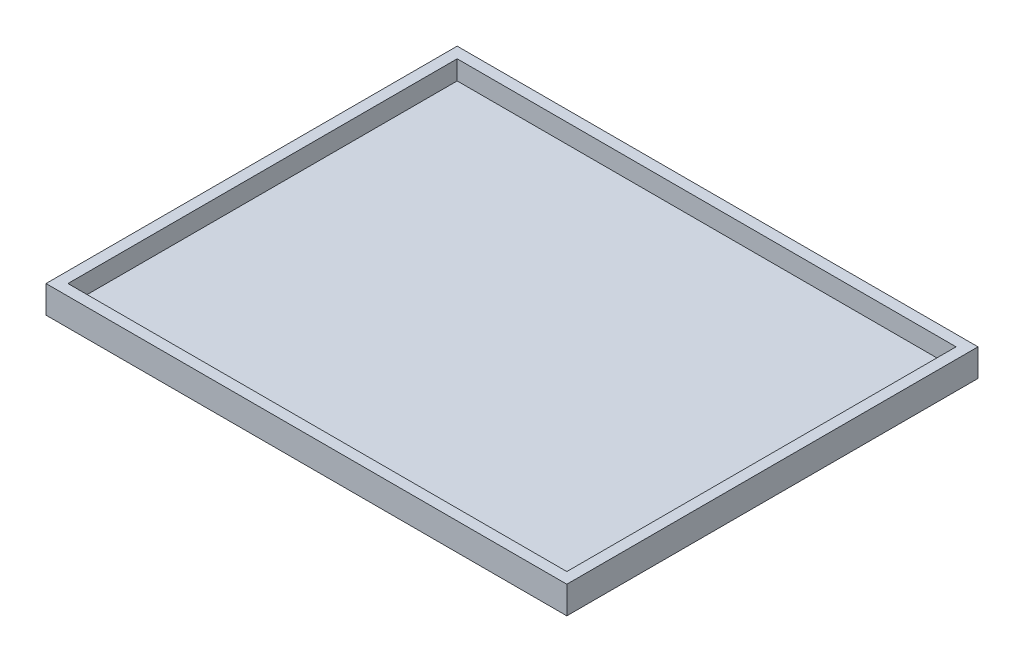
ISO-10303-21;
HEADER;
FILE_DESCRIPTION(('STEP AP214'),'2;1');
FILE_NAME('part.step','',(''),(''),'','','');
FILE_SCHEMA(('AUTOMOTIVE_DESIGN { 1 0 10303 214 1 1 1 1 }'));
ENDSEC;
DATA;
#1=APPLICATION_CONTEXT('core data for automotive mechanical design processes');
#2=APPLICATION_PROTOCOL_DEFINITION('international standard','automotive_design',2000,#1);
#3=PRODUCT_CONTEXT('',#1,'mechanical');
#4=PRODUCT('Part','Part','',(#3));
#5=PRODUCT_RELATED_PRODUCT_CATEGORY('part','',(#4));
#6=PRODUCT_DEFINITION_FORMATION('','',#4);
#7=PRODUCT_DEFINITION_CONTEXT('part definition',#1,'design');
#8=PRODUCT_DEFINITION('design','',#6,#7);
#9=PRODUCT_DEFINITION_SHAPE('','',#8);
#10=(LENGTH_UNIT() NAMED_UNIT(*) SI_UNIT(.MILLI.,.METRE.));
#11=(NAMED_UNIT(*) PLANE_ANGLE_UNIT() SI_UNIT($,.RADIAN.));
#12=(NAMED_UNIT(*) SI_UNIT($,.STERADIAN.) SOLID_ANGLE_UNIT());
#13=UNCERTAINTY_MEASURE_WITH_UNIT(LENGTH_MEASURE(1.E-05),#10,'distance_accuracy_value','');
#14=(GEOMETRIC_REPRESENTATION_CONTEXT(3) GLOBAL_UNCERTAINTY_ASSIGNED_CONTEXT((#13)) GLOBAL_UNIT_ASSIGNED_CONTEXT((#10,
#11,#12)) REPRESENTATION_CONTEXT('',''));
#15=CARTESIAN_POINT('',(0.,0.,0.));
#16=DIRECTION('',(0.,0.,1.));
#17=DIRECTION('',(1.,0.,0.));
#18=AXIS2_PLACEMENT_3D('',#15,#16,#17);
#19=CARTESIAN_POINT('',(-8.23333333333333,5.,-63.8083333333333));
#20=DIRECTION('',(-1.,0.,0.));
#21=DIRECTION('',(0.,0.,1.));
#22=AXIS2_PLACEMENT_3D('',#19,#20,#21);
#23=PLANE('',#22);
#24=DIRECTION('',(0.,0.,-1.));
#25=VECTOR('',#24,1.);
#26=CARTESIAN_POINT('',(-8.23333333333333,0.,-63.8083333333333));
#27=LINE('',#26,#25);
#28=CARTESIAN_POINT('',(-8.23333333333331,0.,11.1916666666667));
#29=VERTEX_POINT('',#28);
#30=CARTESIAN_POINT('',(-8.23333333333333,0.,-63.8083333333333));
#31=VERTEX_POINT('',#30);
#32=EDGE_CURVE('E143',#29,#31,#27,.T.);
#33=ORIENTED_EDGE('',*,*,#32,.T.);
#34=DIRECTION('',(0.,-1.,0.));
#35=VECTOR('',#34,1.);
#36=CARTESIAN_POINT('',(-8.23333333333333,5.,-63.8083333333333));
#37=LINE('',#36,#35);
#38=CARTESIAN_POINT('',(-8.23333333333333,5.,-63.8083333333333));
#39=VERTEX_POINT('',#38);
#40=EDGE_CURVE('E11',#39,#31,#37,.T.);
#41=ORIENTED_EDGE('',*,*,#40,.F.);
#42=DIRECTION('',(0.,0.,-1.));
#43=VECTOR('',#42,1.);
#44=CARTESIAN_POINT('',(-8.23333333333333,5.,-63.8083333333333));
#45=LINE('',#44,#43);
#46=CARTESIAN_POINT('',(-8.23333333333331,5.,11.1916666666667));
#47=VERTEX_POINT('',#46);
#48=EDGE_CURVE('E147',#47,#39,#45,.T.);
#49=ORIENTED_EDGE('',*,*,#48,.F.);
#50=DIRECTION('',(0.,-1.,0.));
#51=VECTOR('',#50,1.);
#52=CARTESIAN_POINT('',(-8.23333333333331,5.,11.1916666666667));
#53=LINE('',#52,#51);
#54=EDGE_CURVE('E153',#47,#29,#53,.T.);
#55=ORIENTED_EDGE('',*,*,#54,.T.);
#56=EDGE_LOOP('',(#33,#41,#49,#55));
#57=FACE_BOUND('',#56,.T.);
#58=ADVANCED_FACE('F35',(#57),#23,.F.);
#59=CARTESIAN_POINT('',(-103.233333333333,5.,-63.8083333333333));
#60=DIRECTION('',(0.,0.,1.));
#61=DIRECTION('',(1.,0.,0.));
#62=AXIS2_PLACEMENT_3D('',#59,#60,#61);
#63=PLANE('',#62);
#64=DIRECTION('',(-1.,0.,0.));
#65=VECTOR('',#64,1.);
#66=CARTESIAN_POINT('',(-103.233333333333,0.,-63.8083333333333));
#67=LINE('',#66,#65);
#68=CARTESIAN_POINT('',(-103.233333333333,0.,-63.8083333333333));
#69=VERTEX_POINT('',#68);
#70=EDGE_CURVE('E156',#31,#69,#67,.T.);
#71=ORIENTED_EDGE('',*,*,#70,.T.);
#72=DIRECTION('',(0.,-1.,0.));
#73=VECTOR('',#72,1.);
#74=CARTESIAN_POINT('',(-103.233333333333,5.,-63.8083333333333));
#75=LINE('',#74,#73);
#76=CARTESIAN_POINT('',(-103.233333333333,5.,-63.8083333333333));
#77=VERTEX_POINT('',#76);
#78=EDGE_CURVE('E42',#77,#69,#75,.T.);
#79=ORIENTED_EDGE('',*,*,#78,.F.);
#80=DIRECTION('',(-1.,0.,0.));
#81=VECTOR('',#80,1.);
#82=CARTESIAN_POINT('',(-103.233333333333,5.,-63.8083333333333));
#83=LINE('',#82,#81);
#84=EDGE_CURVE('E86',#39,#77,#83,.T.);
#85=ORIENTED_EDGE('',*,*,#84,.F.);
#86=ORIENTED_EDGE('',*,*,#40,.T.);
#87=EDGE_LOOP('',(#71,#79,#85,#86));
#88=FACE_BOUND('',#87,.T.);
#89=ADVANCED_FACE('F185',(#88),#63,.F.);
#90=CARTESIAN_POINT('',(-103.233333333333,5.,-63.8083333333333));
#91=DIRECTION('',(1.,0.,0.));
#92=DIRECTION('',(0.,0.,-1.));
#93=AXIS2_PLACEMENT_3D('',#90,#91,#92);
#94=PLANE('',#93);
#95=DIRECTION('',(0.,0.,1.));
#96=VECTOR('',#95,1.);
#97=CARTESIAN_POINT('',(-103.233333333333,0.,-63.8083333333333));
#98=LINE('',#97,#96);
#99=CARTESIAN_POINT('',(-103.233333333333,0.,11.1916666666667));
#100=VERTEX_POINT('',#99);
#101=EDGE_CURVE('E158',#69,#100,#98,.T.);
#102=ORIENTED_EDGE('',*,*,#101,.T.);
#103=DIRECTION('',(0.,-1.,0.));
#104=VECTOR('',#103,1.);
#105=CARTESIAN_POINT('',(-103.233333333333,5.,11.1916666666667));
#106=LINE('',#105,#104);
#107=CARTESIAN_POINT('',(-103.233333333333,5.,11.1916666666667));
#108=VERTEX_POINT('',#107);
#109=EDGE_CURVE('E162',#108,#100,#106,.T.);
#110=ORIENTED_EDGE('',*,*,#109,.F.);
#111=DIRECTION('',(0.,0.,1.));
#112=VECTOR('',#111,1.);
#113=CARTESIAN_POINT('',(-103.233333333333,5.,-63.8083333333333));
#114=LINE('',#113,#112);
#115=EDGE_CURVE('E150',#77,#108,#114,.T.);
#116=ORIENTED_EDGE('',*,*,#115,.F.);
#117=ORIENTED_EDGE('',*,*,#78,.T.);
#118=EDGE_LOOP('',(#102,#110,#116,#117));
#119=FACE_BOUND('',#118,.T.);
#120=ADVANCED_FACE('F167',(#119),#94,.F.);
#121=CARTESIAN_POINT('',(-103.233333333333,5.,11.1916666666667));
#122=DIRECTION('',(0.,0.,-1.));
#123=DIRECTION('',(-1.,0.,0.));
#124=AXIS2_PLACEMENT_3D('',#121,#122,#123);
#125=PLANE('',#124);
#126=DIRECTION('',(1.,0.,0.));
#127=VECTOR('',#126,1.);
#128=CARTESIAN_POINT('',(-103.233333333333,0.,11.1916666666667));
#129=LINE('',#128,#127);
#130=EDGE_CURVE('E79',#100,#29,#129,.T.);
#131=ORIENTED_EDGE('',*,*,#130,.T.);
#132=ORIENTED_EDGE('',*,*,#54,.F.);
#133=DIRECTION('',(1.,0.,0.));
#134=VECTOR('',#133,1.);
#135=CARTESIAN_POINT('',(-103.233333333333,5.,11.1916666666667));
#136=LINE('',#135,#134);
#137=EDGE_CURVE('E58',#108,#47,#136,.T.);
#138=ORIENTED_EDGE('',*,*,#137,.F.);
#139=ORIENTED_EDGE('',*,*,#109,.T.);
#140=EDGE_LOOP('',(#131,#132,#138,#139));
#141=FACE_BOUND('',#140,.T.);
#142=ADVANCED_FACE('F175',(#141),#125,.F.);
#143=CARTESIAN_POINT('',(0.,5.,0.));
#144=DIRECTION('',(0.,1.,0.));
#145=DIRECTION('',(0.,0.,1.));
#146=AXIS2_PLACEMENT_3D('',#143,#144,#145);
#147=PLANE('',#146);
#148=DIRECTION('',(1.,0.,0.));
#149=VECTOR('',#148,1.);
#150=CARTESIAN_POINT('',(-101.233333333333,5.,9.19166666666667));
#151=LINE('',#150,#149);
#152=CARTESIAN_POINT('',(-101.233333333333,5.,9.19166666666667));
#153=VERTEX_POINT('',#152);
#154=CARTESIAN_POINT('',(-10.2333333333333,5.,9.19166666666667));
#155=VERTEX_POINT('',#154);
#156=EDGE_CURVE('E49',#153,#155,#151,.T.);
#157=ORIENTED_EDGE('',*,*,#156,.F.);
#158=DIRECTION('',(0.,0.,1.));
#159=VECTOR('',#158,1.);
#160=CARTESIAN_POINT('',(-101.233333333333,5.,-61.8083333333333));
#161=LINE('',#160,#159);
#162=CARTESIAN_POINT('',(-101.233333333333,5.,-61.8083333333333));
#163=VERTEX_POINT('',#162);
#164=EDGE_CURVE('E128',#163,#153,#161,.T.);
#165=ORIENTED_EDGE('',*,*,#164,.F.);
#166=DIRECTION('',(-1.,0.,0.));
#167=VECTOR('',#166,1.);
#168=CARTESIAN_POINT('',(-10.2333333333333,5.,-61.8083333333333));
#169=LINE('',#168,#167);
#170=CARTESIAN_POINT('',(-10.2333333333333,5.,-61.8083333333333));
#171=VERTEX_POINT('',#170);
#172=EDGE_CURVE('E131',#171,#163,#169,.T.);
#173=ORIENTED_EDGE('',*,*,#172,.F.);
#174=DIRECTION('',(0.,0.,-1.));
#175=VECTOR('',#174,1.);
#176=CARTESIAN_POINT('',(-10.2333333333333,5.,9.19166666666667));
#177=LINE('',#176,#175);
#178=EDGE_CURVE('E137',#155,#171,#177,.T.);
#179=ORIENTED_EDGE('',*,*,#178,.F.);
#180=EDGE_LOOP('',(#157,#165,#173,#179));
#181=FACE_BOUND('',#180,.T.);
#182=ORIENTED_EDGE('',*,*,#48,.T.);
#183=ORIENTED_EDGE('',*,*,#84,.T.);
#184=ORIENTED_EDGE('',*,*,#115,.T.);
#185=ORIENTED_EDGE('',*,*,#137,.T.);
#186=EDGE_LOOP('',(#182,#183,#184,#185));
#187=FACE_BOUND('',#186,.T.);
#188=ADVANCED_FACE('F177',(#181,#187),#147,.T.);
#189=CARTESIAN_POINT('',(0.,0.,0.));
#190=DIRECTION('',(0.,1.,0.));
#191=DIRECTION('',(0.,0.,1.));
#192=AXIS2_PLACEMENT_3D('',#189,#190,#191);
#193=PLANE('',#192);
#194=ORIENTED_EDGE('',*,*,#32,.F.);
#195=ORIENTED_EDGE('',*,*,#130,.F.);
#196=ORIENTED_EDGE('',*,*,#101,.F.);
#197=ORIENTED_EDGE('',*,*,#70,.F.);
#198=EDGE_LOOP('',(#194,#195,#196,#197));
#199=FACE_BOUND('',#198,.T.);
#200=ADVANCED_FACE('F171',(#199),#193,.F.);
#201=CARTESIAN_POINT('',(-101.233333333333,1.5,9.19166666666667));
#202=DIRECTION('',(0.,0.,1.));
#203=DIRECTION('',(1.,0.,0.));
#204=AXIS2_PLACEMENT_3D('',#201,#202,#203);
#205=PLANE('',#204);
#206=ORIENTED_EDGE('',*,*,#156,.T.);
#207=DIRECTION('',(0.,1.,0.));
#208=VECTOR('',#207,1.);
#209=CARTESIAN_POINT('',(-10.2333333333333,1.5,9.19166666666667));
#210=LINE('',#209,#208);
#211=CARTESIAN_POINT('',(-10.2333333333333,1.5,9.19166666666667));
#212=VERTEX_POINT('',#211);
#213=EDGE_CURVE('E106',#212,#155,#210,.T.);
#214=ORIENTED_EDGE('',*,*,#213,.F.);
#215=DIRECTION('',(1.,0.,0.));
#216=VECTOR('',#215,1.);
#217=CARTESIAN_POINT('',(-101.233333333333,1.5,9.19166666666667));
#218=LINE('',#217,#216);
#219=CARTESIAN_POINT('',(-101.233333333333,1.5,9.19166666666667));
#220=VERTEX_POINT('',#219);
#221=EDGE_CURVE('E110',#220,#212,#218,.T.);
#222=ORIENTED_EDGE('',*,*,#221,.F.);
#223=DIRECTION('',(0.,1.,0.));
#224=VECTOR('',#223,1.);
#225=CARTESIAN_POINT('',(-101.233333333333,1.5,9.19166666666667));
#226=LINE('',#225,#224);
#227=EDGE_CURVE('E141',#220,#153,#226,.T.);
#228=ORIENTED_EDGE('',*,*,#227,.T.);
#229=EDGE_LOOP('',(#206,#214,#222,#228));
#230=FACE_BOUND('',#229,.T.);
#231=ADVANCED_FACE('F108',(#230),#205,.F.);
#232=CARTESIAN_POINT('',(-101.233333333333,1.5,-61.8083333333333));
#233=DIRECTION('',(-1.,0.,0.));
#234=DIRECTION('',(0.,0.,1.));
#235=AXIS2_PLACEMENT_3D('',#232,#233,#234);
#236=PLANE('',#235);
#237=ORIENTED_EDGE('',*,*,#164,.T.);
#238=ORIENTED_EDGE('',*,*,#227,.F.);
#239=DIRECTION('',(0.,0.,1.));
#240=VECTOR('',#239,1.);
#241=CARTESIAN_POINT('',(-101.233333333333,1.5,-61.8083333333333));
#242=LINE('',#241,#240);
#243=CARTESIAN_POINT('',(-101.233333333333,1.5,-61.8083333333333));
#244=VERTEX_POINT('',#243);
#245=EDGE_CURVE('E116',#244,#220,#242,.T.);
#246=ORIENTED_EDGE('',*,*,#245,.F.);
#247=DIRECTION('',(0.,1.,0.));
#248=VECTOR('',#247,1.);
#249=CARTESIAN_POINT('',(-101.233333333333,1.5,-61.8083333333333));
#250=LINE('',#249,#248);
#251=EDGE_CURVE('E144',#244,#163,#250,.T.);
#252=ORIENTED_EDGE('',*,*,#251,.T.);
#253=EDGE_LOOP('',(#237,#238,#246,#252));
#254=FACE_BOUND('',#253,.T.);
#255=ADVANCED_FACE('F224',(#254),#236,.F.);
#256=CARTESIAN_POINT('',(-10.2333333333333,1.5,-61.8083333333333));
#257=DIRECTION('',(0.,0.,-1.));
#258=DIRECTION('',(-1.,0.,0.));
#259=AXIS2_PLACEMENT_3D('',#256,#257,#258);
#260=PLANE('',#259);
#261=ORIENTED_EDGE('',*,*,#172,.T.);
#262=ORIENTED_EDGE('',*,*,#251,.F.);
#263=DIRECTION('',(-1.,0.,0.));
#264=VECTOR('',#263,1.);
#265=CARTESIAN_POINT('',(-10.2333333333333,1.5,-61.8083333333333));
#266=LINE('',#265,#264);
#267=CARTESIAN_POINT('',(-10.2333333333333,1.5,-61.8083333333333));
#268=VERTEX_POINT('',#267);
#269=EDGE_CURVE('E124',#268,#244,#266,.T.);
#270=ORIENTED_EDGE('',*,*,#269,.F.);
#271=DIRECTION('',(0.,1.,0.));
#272=VECTOR('',#271,1.);
#273=CARTESIAN_POINT('',(-10.2333333333333,1.5,-61.8083333333333));
#274=LINE('',#273,#272);
#275=EDGE_CURVE('E115',#268,#171,#274,.T.);
#276=ORIENTED_EDGE('',*,*,#275,.T.);
#277=EDGE_LOOP('',(#261,#262,#270,#276));
#278=FACE_BOUND('',#277,.T.);
#279=ADVANCED_FACE('F233',(#278),#260,.F.);
#280=CARTESIAN_POINT('',(-10.2333333333333,1.5,9.19166666666667));
#281=DIRECTION('',(1.,0.,0.));
#282=DIRECTION('',(0.,0.,-1.));
#283=AXIS2_PLACEMENT_3D('',#280,#281,#282);
#284=PLANE('',#283);
#285=ORIENTED_EDGE('',*,*,#178,.T.);
#286=ORIENTED_EDGE('',*,*,#275,.F.);
#287=DIRECTION('',(0.,0.,-1.));
#288=VECTOR('',#287,1.);
#289=CARTESIAN_POINT('',(-10.2333333333333,1.5,9.19166666666667));
#290=LINE('',#289,#288);
#291=EDGE_CURVE('E119',#212,#268,#290,.T.);
#292=ORIENTED_EDGE('',*,*,#291,.F.);
#293=ORIENTED_EDGE('',*,*,#213,.T.);
#294=EDGE_LOOP('',(#285,#286,#292,#293));
#295=FACE_BOUND('',#294,.T.);
#296=ADVANCED_FACE('F120',(#295),#284,.F.);
#297=CARTESIAN_POINT('',(0.,1.5,0.));
#298=DIRECTION('',(0.,1.,0.));
#299=DIRECTION('',(0.,0.,1.));
#300=AXIS2_PLACEMENT_3D('',#297,#298,#299);
#301=PLANE('',#300);
#302=ORIENTED_EDGE('',*,*,#221,.T.);
#303=ORIENTED_EDGE('',*,*,#291,.T.);
#304=ORIENTED_EDGE('',*,*,#269,.T.);
#305=ORIENTED_EDGE('',*,*,#245,.T.);
#306=EDGE_LOOP('',(#302,#303,#304,#305));
#307=FACE_BOUND('',#306,.T.);
#308=ADVANCED_FACE('F126',(#307),#301,.T.);
#309=CLOSED_SHELL('',(#58,#89,#120,#142,#188,#200,#231,#255,#279,#296,#308));
#310=MANIFOLD_SOLID_BREP('B2',#309);
#311=ADVANCED_BREP_SHAPE_REPRESENTATION('',(#18,#310),#14);
#312=SHAPE_DEFINITION_REPRESENTATION(#9,#311);
ENDSEC;
END-ISO-10303-21;
